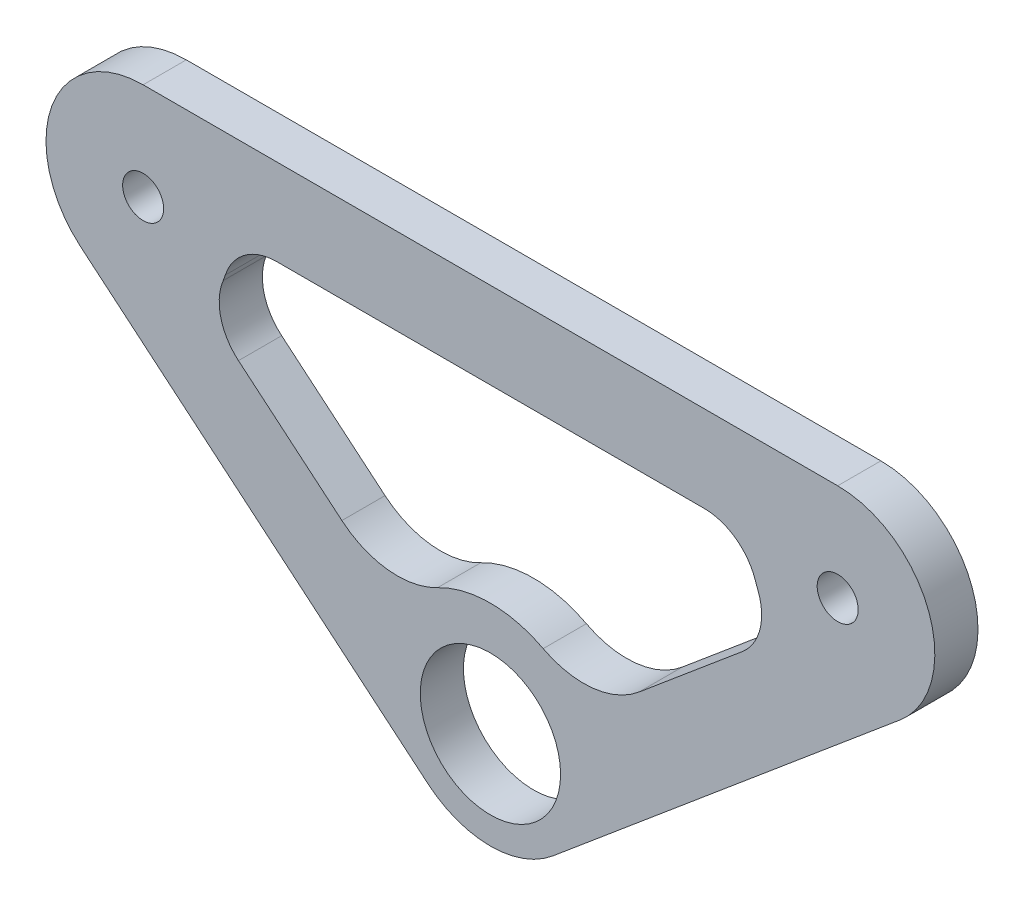
ISO-10303-21;
HEADER;
FILE_DESCRIPTION(('STEP AP214'),'2;1');
FILE_NAME('part.step','',(''),(''),'','','');
FILE_SCHEMA(('AUTOMOTIVE_DESIGN { 1 0 10303 214 1 1 1 1 }'));
ENDSEC;
DATA;
#1=APPLICATION_CONTEXT('core data for automotive mechanical design processes');
#2=APPLICATION_PROTOCOL_DEFINITION('international standard','automotive_design',2000,#1);
#3=PRODUCT_CONTEXT('',#1,'mechanical');
#4=PRODUCT('Part','Part','',(#3));
#5=PRODUCT_RELATED_PRODUCT_CATEGORY('part','',(#4));
#6=PRODUCT_DEFINITION_FORMATION('','',#4);
#7=PRODUCT_DEFINITION_CONTEXT('part definition',#1,'design');
#8=PRODUCT_DEFINITION('design','',#6,#7);
#9=PRODUCT_DEFINITION_SHAPE('','',#8);
#10=(LENGTH_UNIT() NAMED_UNIT(*) SI_UNIT(.MILLI.,.METRE.));
#11=(NAMED_UNIT(*) PLANE_ANGLE_UNIT() SI_UNIT($,.RADIAN.));
#12=(NAMED_UNIT(*) SI_UNIT($,.STERADIAN.) SOLID_ANGLE_UNIT());
#13=UNCERTAINTY_MEASURE_WITH_UNIT(LENGTH_MEASURE(1.E-05),#10,'distance_accuracy_value','');
#14=(GEOMETRIC_REPRESENTATION_CONTEXT(3) GLOBAL_UNCERTAINTY_ASSIGNED_CONTEXT((#13)) GLOBAL_UNIT_ASSIGNED_CONTEXT((#10,
#11,#12)) REPRESENTATION_CONTEXT('',''));
#15=CARTESIAN_POINT('',(0.,0.,0.));
#16=DIRECTION('',(0.,0.,1.));
#17=DIRECTION('',(1.,0.,0.));
#18=AXIS2_PLACEMENT_3D('',#15,#16,#17);
#19=CARTESIAN_POINT('',(-32.1738666109965,26.9970796068333,4.));
#20=DIRECTION('',(0.,0.,1.));
#21=DIRECTION('',(1.,0.,0.));
#22=AXIS2_PLACEMENT_3D('',#19,#20,#21);
#23=PLANE('',#22);
#24=CARTESIAN_POINT('',(32.1738666109965,26.9970796068333,4.));
#25=DIRECTION('',(0.,0.,1.));
#26=DIRECTION('',(1.,0.,0.));
#27=AXIS2_PLACEMENT_3D('',#24,#25,#26);
#28=CIRCLE('',#27,1.90000000000001);
#29=CARTESIAN_POINT('',(34.0738666109965,26.9970796068333,4.));
#30=VERTEX_POINT('',#29);
#31=EDGE_CURVE('E408',#30,#30,#28,.T.);
#32=ORIENTED_EDGE('',*,*,#31,.F.);
#33=EDGE_LOOP('',(#32));
#34=FACE_BOUND('',#33,.T.);
#35=CARTESIAN_POINT('',(8.61864834312076,16.3697556712864,4.));
#36=DIRECTION('',(0.,0.,1.));
#37=DIRECTION('',(1.,0.,0.));
#38=AXIS2_PLACEMENT_3D('',#35,#36,#37);
#39=CIRCLE('',#38,8.00000000000009);
#40=CARTESIAN_POINT('',(4.89166527582517,9.29094240802726,4.));
#41=VERTEX_POINT('',#40);
#42=CARTESIAN_POINT('',(13.7609492206135,10.2414001263348,4.));
#43=VERTEX_POINT('',#42);
#44=EDGE_CURVE('E168',#41,#43,#39,.T.);
#45=ORIENTED_EDGE('',*,*,#44,.F.);
#46=CARTESIAN_POINT('',(0.,0.,4.));
#47=DIRECTION('',(0.,0.,-1.));
#48=DIRECTION('',(1.,0.,0.));
#49=AXIS2_PLACEMENT_3D('',#46,#47,#48);
#50=CIRCLE('',#49,10.4999999999999);
#51=CARTESIAN_POINT('',(-4.89166527582612,9.29094240802688,4.));
#52=VERTEX_POINT('',#51);
#53=EDGE_CURVE('E160',#52,#41,#50,.T.);
#54=ORIENTED_EDGE('',*,*,#53,.F.);
#55=CARTESIAN_POINT('',(-8.61864834312165,16.3697556712859,4.));
#56=DIRECTION('',(0.,0.,1.));
#57=DIRECTION('',(1.,0.,0.));
#58=AXIS2_PLACEMENT_3D('',#55,#56,#57);
#59=CIRCLE('',#58,7.99999999999992);
#60=CARTESIAN_POINT('',(-13.7609492206136,10.2414001263338,4.));
#61=VERTEX_POINT('',#60);
#62=EDGE_CURVE('E203',#61,#52,#59,.T.);
#63=ORIENTED_EDGE('',*,*,#62,.F.);
#64=DIRECTION('',(0.766044443118998,-0.642787609686516,0.));
#65=VECTOR('',#64,1.);
#66=CARTESIAN_POINT('',(-13.7609492206137,10.2414001263337,4.));
#67=LINE('',#66,#65);
#68=CARTESIAN_POINT('',(-23.3412077619919,18.2801915349867,4.));
#69=VERTEX_POINT('',#68);
#70=EDGE_CURVE('E201',#69,#61,#67,.T.);
#71=ORIENTED_EDGE('',*,*,#70,.F.);
#72=CARTESIAN_POINT('',(-20.1272697135595,22.1104137505819,4.));
#73=DIRECTION('',(0.,0.,1.));
#74=DIRECTION('',(1.,0.,0.));
#75=AXIS2_PLACEMENT_3D('',#72,#73,#74);
#76=CIRCLE('',#75,5.00000000000008);
#77=CARTESIAN_POINT('',(-24.7605762125742,23.9899006183702,4.));
#78=VERTEX_POINT('',#77);
#79=EDGE_CURVE('E199',#78,#69,#76,.T.);
#80=ORIENTED_EDGE('',*,*,#79,.F.);
#81=CARTESIAN_POINT('',(-32.1738666109965,26.9970796068333,4.));
#82=DIRECTION('',(0.,0.,-1.));
#83=DIRECTION('',(1.,0.,0.));
#84=AXIS2_PLACEMENT_3D('',#81,#82,#83);
#85=CIRCLE('',#84,7.99999999999967);
#86=CARTESIAN_POINT('',(-24.5619793021638,24.5355411452953,4.));
#87=VERTEX_POINT('',#86);
#88=EDGE_CURVE('E197',#87,#78,#85,.T.);
#89=ORIENTED_EDGE('',*,*,#88,.F.);
#90=CARTESIAN_POINT('',(-19.8045497341433,22.9970796068335,4.));
#91=DIRECTION('',(0.,0.,1.));
#92=DIRECTION('',(1.,0.,0.));
#93=AXIS2_PLACEMENT_3D('',#90,#91,#92);
#94=CIRCLE('',#93,5.00000000000025);
#95=CARTESIAN_POINT('',(-19.8045497341433,27.9970796068335,4.));
#96=VERTEX_POINT('',#95);
#97=EDGE_CURVE('E195',#96,#87,#94,.T.);
#98=ORIENTED_EDGE('',*,*,#97,.F.);
#99=DIRECTION('',(-1.,0.,0.));
#100=VECTOR('',#99,1.);
#101=CARTESIAN_POINT('',(-19.8045497341433,27.9970796068335,4.));
#102=LINE('',#101,#100);
#103=CARTESIAN_POINT('',(19.8045497341433,27.9970796068335,4.));
#104=VERTEX_POINT('',#103);
#105=EDGE_CURVE('E193',#104,#96,#102,.T.);
#106=ORIENTED_EDGE('',*,*,#105,.F.);
#107=CARTESIAN_POINT('',(19.8045497341433,22.9970796068336,4.));
#108=DIRECTION('',(0.,0.,1.));
#109=DIRECTION('',(1.,0.,0.));
#110=AXIS2_PLACEMENT_3D('',#107,#108,#109);
#111=CIRCLE('',#110,4.99999999999994);
#112=CARTESIAN_POINT('',(24.5619793021642,24.5355411452938,4.));
#113=VERTEX_POINT('',#112);
#114=EDGE_CURVE('E191',#113,#104,#111,.T.);
#115=ORIENTED_EDGE('',*,*,#114,.F.);
#116=CARTESIAN_POINT('',(32.1738666109965,26.9970796068333,4.));
#117=DIRECTION('',(0.,0.,-1.));
#118=DIRECTION('',(1.,0.,0.));
#119=AXIS2_PLACEMENT_3D('',#116,#117,#118);
#120=CIRCLE('',#119,8.00000000000002);
#121=CARTESIAN_POINT('',(24.7605762125735,23.9899006183719,4.));
#122=VERTEX_POINT('',#121);
#123=EDGE_CURVE('E189',#122,#113,#120,.T.);
#124=ORIENTED_EDGE('',*,*,#123,.F.);
#125=CARTESIAN_POINT('',(20.1272697135595,22.1104137505825,4.));
#126=DIRECTION('',(0.,0.,1.));
#127=DIRECTION('',(1.,0.,0.));
#128=AXIS2_PLACEMENT_3D('',#125,#126,#127);
#129=CIRCLE('',#128,4.99999999999985);
#130=CARTESIAN_POINT('',(23.3412077619919,18.2801915349873,4.));
#131=VERTEX_POINT('',#130);
#132=EDGE_CURVE('E184',#131,#122,#129,.T.);
#133=ORIENTED_EDGE('',*,*,#132,.F.);
#134=DIRECTION('',(0.766044443119009,0.642787609686502,0.));
#135=VECTOR('',#134,1.);
#136=CARTESIAN_POINT('',(23.3412077619919,18.2801915349873,4.));
#137=LINE('',#136,#135);
#138=EDGE_CURVE('E182',#43,#131,#137,.T.);
#139=ORIENTED_EDGE('',*,*,#138,.F.);
#140=EDGE_LOOP('',(#45,#54,#63,#71,#80,#89,#98,#106,#115,#124,#133,#139));
#141=FACE_BOUND('',#140,.T.);
#142=CARTESIAN_POINT('',(-32.1738666109965,26.9970796068333,4.));
#143=DIRECTION('',(0.,0.,1.));
#144=DIRECTION('',(1.,0.,0.));
#145=AXIS2_PLACEMENT_3D('',#142,#143,#144);
#146=CIRCLE('',#145,8.99999999999999);
#147=CARTESIAN_POINT('',(-32.1738666109965,35.9970796068333,4.));
#148=VERTEX_POINT('',#147);
#149=CARTESIAN_POINT('',(-37.9589550981763,20.1026796187633,4.));
#150=VERTEX_POINT('',#149);
#151=EDGE_CURVE('E256',#148,#150,#146,.T.);
#152=ORIENTED_EDGE('',*,*,#151,.T.);
#153=DIRECTION('',(0.766044443118992,-0.642787609686523,0.));
#154=VECTOR('',#153,1.);
#155=CARTESIAN_POINT('',(-5.78508848717973,-6.89439998806977,4.));
#156=LINE('',#155,#154);
#157=CARTESIAN_POINT('',(-5.78508848717987,-6.89439998806994,4.));
#158=VERTEX_POINT('',#157);
#159=EDGE_CURVE('E259',#150,#158,#156,.T.);
#160=ORIENTED_EDGE('',*,*,#159,.T.);
#161=CARTESIAN_POINT('',(0.,0.,4.));
#162=DIRECTION('',(0.,0.,1.));
#163=DIRECTION('',(1.,0.,0.));
#164=AXIS2_PLACEMENT_3D('',#161,#162,#163);
#165=CIRCLE('',#164,8.99999999999999);
#166=CARTESIAN_POINT('',(5.78508848717529,-6.89439998807406,4.));
#167=VERTEX_POINT('',#166);
#168=EDGE_CURVE('E262',#158,#167,#165,.T.);
#169=ORIENTED_EDGE('',*,*,#168,.T.);
#170=DIRECTION('',(0.766044443118991,0.642787609686524,0.));
#171=VECTOR('',#170,1.);
#172=CARTESIAN_POINT('',(37.9589550981718,20.102679618759,4.));
#173=LINE('',#172,#171);
#174=CARTESIAN_POINT('',(37.9589550981717,20.1026796187592,4.));
#175=VERTEX_POINT('',#174);
#176=EDGE_CURVE('E264',#167,#175,#173,.T.);
#177=ORIENTED_EDGE('',*,*,#176,.T.);
#178=CARTESIAN_POINT('',(32.1738666109965,26.9970796068333,4.));
#179=DIRECTION('',(0.,0.,1.));
#180=DIRECTION('',(1.,0.,0.));
#181=AXIS2_PLACEMENT_3D('',#178,#179,#180);
#182=CIRCLE('',#181,9.00000000000016);
#183=CARTESIAN_POINT('',(32.1738666109965,35.9970796068333,4.));
#184=VERTEX_POINT('',#183);
#185=EDGE_CURVE('E266',#175,#184,#182,.T.);
#186=ORIENTED_EDGE('',*,*,#185,.T.);
#187=DIRECTION('',(-1.,0.,0.));
#188=VECTOR('',#187,1.);
#189=CARTESIAN_POINT('',(-32.1738666109965,35.9970796068333,4.));
#190=LINE('',#189,#188);
#191=EDGE_CURVE('E268',#184,#148,#190,.T.);
#192=ORIENTED_EDGE('',*,*,#191,.T.);
#193=EDGE_LOOP('',(#152,#160,#169,#177,#186,#192));
#194=FACE_BOUND('',#193,.T.);
#195=CARTESIAN_POINT('',(0.,0.,4.));
#196=DIRECTION('',(0.,0.,1.));
#197=DIRECTION('',(1.,0.,0.));
#198=AXIS2_PLACEMENT_3D('',#195,#196,#197);
#199=CIRCLE('',#198,6.49999999999995);
#200=CARTESIAN_POINT('',(6.49999999999995,0.,4.));
#201=VERTEX_POINT('',#200);
#202=EDGE_CURVE('E206',#201,#201,#199,.T.);
#203=ORIENTED_EDGE('',*,*,#202,.F.);
#204=EDGE_LOOP('',(#203));
#205=FACE_BOUND('',#204,.T.);
#206=CARTESIAN_POINT('',(-32.1738666109965,26.9970796068333,4.));
#207=DIRECTION('',(0.,0.,1.));
#208=DIRECTION('',(1.,0.,0.));
#209=AXIS2_PLACEMENT_3D('',#206,#207,#208);
#210=CIRCLE('',#209,1.90000000000001);
#211=CARTESIAN_POINT('',(-30.2738666109965,26.9970796068333,4.));
#212=VERTEX_POINT('',#211);
#213=EDGE_CURVE('E399',#212,#212,#210,.T.);
#214=ORIENTED_EDGE('',*,*,#213,.F.);
#215=EDGE_LOOP('',(#214));
#216=FACE_BOUND('',#215,.T.);
#217=ADVANCED_FACE('F35',(#34,#141,#194,#205,#216),#23,.T.);
#218=CARTESIAN_POINT('',(-32.1738666109965,26.9970796068333,0.));
#219=DIRECTION('',(0.,0.,1.));
#220=DIRECTION('',(1.,0.,0.));
#221=AXIS2_PLACEMENT_3D('',#218,#219,#220);
#222=PLANE('',#221);
#223=CARTESIAN_POINT('',(32.1738666109965,26.9970796068333,0.));
#224=DIRECTION('',(0.,0.,1.));
#225=DIRECTION('',(1.,0.,0.));
#226=AXIS2_PLACEMENT_3D('',#223,#224,#225);
#227=CIRCLE('',#226,1.90000000000001);
#228=CARTESIAN_POINT('',(34.0738666109965,26.9970796068333,0.));
#229=VERTEX_POINT('',#228);
#230=EDGE_CURVE('E405',#229,#229,#227,.T.);
#231=ORIENTED_EDGE('',*,*,#230,.T.);
#232=EDGE_LOOP('',(#231));
#233=FACE_BOUND('',#232,.T.);
#234=CARTESIAN_POINT('',(0.,0.,0.));
#235=DIRECTION('',(0.,0.,-1.));
#236=DIRECTION('',(1.,0.,0.));
#237=AXIS2_PLACEMENT_3D('',#234,#235,#236);
#238=CIRCLE('',#237,10.4999999999999);
#239=CARTESIAN_POINT('',(-4.89166527582612,9.29094240802688,0.));
#240=VERTEX_POINT('',#239);
#241=CARTESIAN_POINT('',(4.89166527582517,9.29094240802726,0.));
#242=VERTEX_POINT('',#241);
#243=EDGE_CURVE('E58',#240,#242,#238,.T.);
#244=ORIENTED_EDGE('',*,*,#243,.T.);
#245=CARTESIAN_POINT('',(8.61864834312076,16.3697556712864,0.));
#246=DIRECTION('',(0.,0.,1.));
#247=DIRECTION('',(1.,0.,0.));
#248=AXIS2_PLACEMENT_3D('',#245,#246,#247);
#249=CIRCLE('',#248,8.00000000000009);
#250=CARTESIAN_POINT('',(13.7609492206135,10.2414001263348,0.));
#251=VERTEX_POINT('',#250);
#252=EDGE_CURVE('E175',#242,#251,#249,.T.);
#253=ORIENTED_EDGE('',*,*,#252,.T.);
#254=DIRECTION('',(0.766044443119009,0.642787609686502,0.));
#255=VECTOR('',#254,1.);
#256=CARTESIAN_POINT('',(23.3412077619919,18.2801915349873,0.));
#257=LINE('',#256,#255);
#258=CARTESIAN_POINT('',(23.3412077619919,18.2801915349873,0.));
#259=VERTEX_POINT('',#258);
#260=EDGE_CURVE('E208',#251,#259,#257,.T.);
#261=ORIENTED_EDGE('',*,*,#260,.T.);
#262=CARTESIAN_POINT('',(20.1272697135595,22.1104137505825,0.));
#263=DIRECTION('',(0.,0.,1.));
#264=DIRECTION('',(1.,0.,0.));
#265=AXIS2_PLACEMENT_3D('',#262,#263,#264);
#266=CIRCLE('',#265,4.99999999999985);
#267=CARTESIAN_POINT('',(24.7605762125735,23.9899006183719,0.));
#268=VERTEX_POINT('',#267);
#269=EDGE_CURVE('E211',#259,#268,#266,.T.);
#270=ORIENTED_EDGE('',*,*,#269,.T.);
#271=CARTESIAN_POINT('',(32.1738666109965,26.9970796068333,0.));
#272=DIRECTION('',(0.,0.,-1.));
#273=DIRECTION('',(1.,0.,0.));
#274=AXIS2_PLACEMENT_3D('',#271,#272,#273);
#275=CIRCLE('',#274,8.00000000000002);
#276=CARTESIAN_POINT('',(24.5619793021642,24.5355411452938,0.));
#277=VERTEX_POINT('',#276);
#278=EDGE_CURVE('E214',#268,#277,#275,.T.);
#279=ORIENTED_EDGE('',*,*,#278,.T.);
#280=CARTESIAN_POINT('',(19.8045497341433,22.9970796068336,0.));
#281=DIRECTION('',(0.,0.,1.));
#282=DIRECTION('',(1.,0.,0.));
#283=AXIS2_PLACEMENT_3D('',#280,#281,#282);
#284=CIRCLE('',#283,4.99999999999994);
#285=CARTESIAN_POINT('',(19.8045497341433,27.9970796068335,0.));
#286=VERTEX_POINT('',#285);
#287=EDGE_CURVE('E217',#277,#286,#284,.T.);
#288=ORIENTED_EDGE('',*,*,#287,.T.);
#289=DIRECTION('',(-1.,0.,0.));
#290=VECTOR('',#289,1.);
#291=CARTESIAN_POINT('',(-19.8045497341433,27.9970796068335,0.));
#292=LINE('',#291,#290);
#293=CARTESIAN_POINT('',(-19.8045497341433,27.9970796068335,0.));
#294=VERTEX_POINT('',#293);
#295=EDGE_CURVE('E220',#286,#294,#292,.T.);
#296=ORIENTED_EDGE('',*,*,#295,.T.);
#297=CARTESIAN_POINT('',(-19.8045497341433,22.9970796068335,0.));
#298=DIRECTION('',(0.,0.,1.));
#299=DIRECTION('',(1.,0.,0.));
#300=AXIS2_PLACEMENT_3D('',#297,#298,#299);
#301=CIRCLE('',#300,5.00000000000025);
#302=CARTESIAN_POINT('',(-24.5619793021638,24.5355411452953,0.));
#303=VERTEX_POINT('',#302);
#304=EDGE_CURVE('E223',#294,#303,#301,.T.);
#305=ORIENTED_EDGE('',*,*,#304,.T.);
#306=CARTESIAN_POINT('',(-32.1738666109965,26.9970796068333,0.));
#307=DIRECTION('',(0.,0.,-1.));
#308=DIRECTION('',(1.,0.,0.));
#309=AXIS2_PLACEMENT_3D('',#306,#307,#308);
#310=CIRCLE('',#309,7.99999999999967);
#311=CARTESIAN_POINT('',(-24.7605762125742,23.9899006183702,0.));
#312=VERTEX_POINT('',#311);
#313=EDGE_CURVE('E226',#303,#312,#310,.T.);
#314=ORIENTED_EDGE('',*,*,#313,.T.);
#315=CARTESIAN_POINT('',(-20.1272697135595,22.1104137505819,0.));
#316=DIRECTION('',(0.,0.,1.));
#317=DIRECTION('',(1.,0.,0.));
#318=AXIS2_PLACEMENT_3D('',#315,#316,#317);
#319=CIRCLE('',#318,5.00000000000008);
#320=CARTESIAN_POINT('',(-23.3412077619919,18.2801915349867,0.));
#321=VERTEX_POINT('',#320);
#322=EDGE_CURVE('E229',#312,#321,#319,.T.);
#323=ORIENTED_EDGE('',*,*,#322,.T.);
#324=DIRECTION('',(0.766044443118998,-0.642787609686516,0.));
#325=VECTOR('',#324,1.);
#326=CARTESIAN_POINT('',(-13.7609492206137,10.2414001263337,0.));
#327=LINE('',#326,#325);
#328=CARTESIAN_POINT('',(-13.7609492206137,10.2414001263337,0.));
#329=VERTEX_POINT('',#328);
#330=EDGE_CURVE('E232',#321,#329,#327,.T.);
#331=ORIENTED_EDGE('',*,*,#330,.T.);
#332=CARTESIAN_POINT('',(-8.61864834312165,16.3697556712859,0.));
#333=DIRECTION('',(0.,0.,1.));
#334=DIRECTION('',(1.,0.,0.));
#335=AXIS2_PLACEMENT_3D('',#332,#333,#334);
#336=CIRCLE('',#335,7.99999999999992);
#337=EDGE_CURVE('E169',#329,#240,#336,.T.);
#338=ORIENTED_EDGE('',*,*,#337,.T.);
#339=EDGE_LOOP('',(#244,#253,#261,#270,#279,#288,#296,#305,#314,#323,#331,#338));
#340=FACE_BOUND('',#339,.T.);
#341=CARTESIAN_POINT('',(-32.1738666109965,26.9970796068333,0.));
#342=DIRECTION('',(0.,0.,1.));
#343=DIRECTION('',(1.,0.,0.));
#344=AXIS2_PLACEMENT_3D('',#341,#342,#343);
#345=CIRCLE('',#344,8.99999999999999);
#346=CARTESIAN_POINT('',(-32.1738666109965,35.9970796068333,0.));
#347=VERTEX_POINT('',#346);
#348=CARTESIAN_POINT('',(-37.9589550981763,20.1026796187633,0.));
#349=VERTEX_POINT('',#348);
#350=EDGE_CURVE('E176',#347,#349,#345,.T.);
#351=ORIENTED_EDGE('',*,*,#350,.F.);
#352=DIRECTION('',(-1.,0.,0.));
#353=VECTOR('',#352,1.);
#354=CARTESIAN_POINT('',(-32.1738666109965,35.9970796068333,0.));
#355=LINE('',#354,#353);
#356=CARTESIAN_POINT('',(32.1738666109965,35.9970796068333,0.));
#357=VERTEX_POINT('',#356);
#358=EDGE_CURVE('E260',#357,#347,#355,.T.);
#359=ORIENTED_EDGE('',*,*,#358,.F.);
#360=CARTESIAN_POINT('',(32.1738666109965,26.9970796068333,0.));
#361=DIRECTION('',(0.,0.,1.));
#362=DIRECTION('',(1.,0.,0.));
#363=AXIS2_PLACEMENT_3D('',#360,#361,#362);
#364=CIRCLE('',#363,9.00000000000016);
#365=CARTESIAN_POINT('',(37.9589550981717,20.1026796187592,0.));
#366=VERTEX_POINT('',#365);
#367=EDGE_CURVE('E279',#366,#357,#364,.T.);
#368=ORIENTED_EDGE('',*,*,#367,.F.);
#369=DIRECTION('',(0.766044443118991,0.642787609686524,0.));
#370=VECTOR('',#369,1.);
#371=CARTESIAN_POINT('',(37.9589550981718,20.102679618759,0.));
#372=LINE('',#371,#370);
#373=CARTESIAN_POINT('',(5.78508848717529,-6.89439998807406,0.));
#374=VERTEX_POINT('',#373);
#375=EDGE_CURVE('E277',#374,#366,#372,.T.);
#376=ORIENTED_EDGE('',*,*,#375,.F.);
#377=CARTESIAN_POINT('',(0.,0.,0.));
#378=DIRECTION('',(0.,0.,1.));
#379=DIRECTION('',(1.,0.,0.));
#380=AXIS2_PLACEMENT_3D('',#377,#378,#379);
#381=CIRCLE('',#380,8.99999999999999);
#382=CARTESIAN_POINT('',(-5.78508848717987,-6.89439998806994,0.));
#383=VERTEX_POINT('',#382);
#384=EDGE_CURVE('E275',#383,#374,#381,.T.);
#385=ORIENTED_EDGE('',*,*,#384,.F.);
#386=DIRECTION('',(0.766044443118992,-0.642787609686523,0.));
#387=VECTOR('',#386,1.);
#388=CARTESIAN_POINT('',(-5.78508848717973,-6.89439998806977,0.));
#389=LINE('',#388,#387);
#390=EDGE_CURVE('E273',#349,#383,#389,.T.);
#391=ORIENTED_EDGE('',*,*,#390,.F.);
#392=EDGE_LOOP('',(#351,#359,#368,#376,#385,#391));
#393=FACE_BOUND('',#392,.T.);
#394=CARTESIAN_POINT('',(0.,0.,0.));
#395=DIRECTION('',(0.,0.,1.));
#396=DIRECTION('',(1.,0.,0.));
#397=AXIS2_PLACEMENT_3D('',#394,#395,#396);
#398=CIRCLE('',#397,6.49999999999995);
#399=CARTESIAN_POINT('',(6.49999999999995,0.,0.));
#400=VERTEX_POINT('',#399);
#401=EDGE_CURVE('E411',#400,#400,#398,.T.);
#402=ORIENTED_EDGE('',*,*,#401,.T.);
#403=EDGE_LOOP('',(#402));
#404=FACE_BOUND('',#403,.T.);
#405=CARTESIAN_POINT('',(-32.1738666109965,26.9970796068333,0.));
#406=DIRECTION('',(0.,0.,1.));
#407=DIRECTION('',(1.,0.,0.));
#408=AXIS2_PLACEMENT_3D('',#405,#406,#407);
#409=CIRCLE('',#408,1.90000000000001);
#410=CARTESIAN_POINT('',(-30.2738666109965,26.9970796068333,0.));
#411=VERTEX_POINT('',#410);
#412=EDGE_CURVE('E402',#411,#411,#409,.T.);
#413=ORIENTED_EDGE('',*,*,#412,.T.);
#414=EDGE_LOOP('',(#413));
#415=FACE_BOUND('',#414,.T.);
#416=ADVANCED_FACE('F303',(#233,#340,#393,#404,#415),#222,.F.);
#417=CARTESIAN_POINT('',(-32.1738666109965,26.9970796068333,4.));
#418=DIRECTION('',(0.,0.,-1.));
#419=DIRECTION('',(-1.,0.,0.));
#420=AXIS2_PLACEMENT_3D('',#417,#418,#419);
#421=CYLINDRICAL_SURFACE('',#420,8.99999999999999);
#422=ORIENTED_EDGE('',*,*,#350,.T.);
#423=DIRECTION('',(0.,0.,-1.));
#424=VECTOR('',#423,1.);
#425=CARTESIAN_POINT('',(-37.9589550981763,20.1026796187633,4.));
#426=LINE('',#425,#424);
#427=EDGE_CURVE('E11',#150,#349,#426,.T.);
#428=ORIENTED_EDGE('',*,*,#427,.F.);
#429=ORIENTED_EDGE('',*,*,#151,.F.);
#430=DIRECTION('',(0.,0.,-1.));
#431=VECTOR('',#430,1.);
#432=CARTESIAN_POINT('',(-32.1738666109965,35.9970796068333,4.));
#433=LINE('',#432,#431);
#434=EDGE_CURVE('E270',#148,#347,#433,.T.);
#435=ORIENTED_EDGE('',*,*,#434,.T.);
#436=EDGE_LOOP('',(#422,#428,#429,#435));
#437=FACE_BOUND('',#436,.T.);
#438=ADVANCED_FACE('F37',(#437),#421,.T.);
#439=CARTESIAN_POINT('',(-5.78508848717973,-6.89439998806977,4.));
#440=DIRECTION('',(0.642787609686523,0.766044443118992,0.));
#441=DIRECTION('',(-0.766044443118992,0.642787609686523,0.));
#442=AXIS2_PLACEMENT_3D('',#439,#440,#441);
#443=PLANE('',#442);
#444=ORIENTED_EDGE('',*,*,#390,.T.);
#445=DIRECTION('',(0.,0.,-1.));
#446=VECTOR('',#445,1.);
#447=CARTESIAN_POINT('',(-5.78508848717987,-6.89439998806994,4.));
#448=LINE('',#447,#446);
#449=EDGE_CURVE('E43',#158,#383,#448,.T.);
#450=ORIENTED_EDGE('',*,*,#449,.F.);
#451=ORIENTED_EDGE('',*,*,#159,.F.);
#452=ORIENTED_EDGE('',*,*,#427,.T.);
#453=EDGE_LOOP('',(#444,#450,#451,#452));
#454=FACE_BOUND('',#453,.T.);
#455=ADVANCED_FACE('F320',(#454),#443,.F.);
#456=CARTESIAN_POINT('',(0.,0.,4.));
#457=DIRECTION('',(0.,0.,-1.));
#458=DIRECTION('',(-1.,0.,0.));
#459=AXIS2_PLACEMENT_3D('',#456,#457,#458);
#460=CYLINDRICAL_SURFACE('',#459,8.99999999999999);
#461=ORIENTED_EDGE('',*,*,#384,.T.);
#462=DIRECTION('',(0.,0.,-1.));
#463=VECTOR('',#462,1.);
#464=CARTESIAN_POINT('',(5.78508848717529,-6.89439998807406,4.));
#465=LINE('',#464,#463);
#466=EDGE_CURVE('E290',#167,#374,#465,.T.);
#467=ORIENTED_EDGE('',*,*,#466,.F.);
#468=ORIENTED_EDGE('',*,*,#168,.F.);
#469=ORIENTED_EDGE('',*,*,#449,.T.);
#470=EDGE_LOOP('',(#461,#467,#468,#469));
#471=FACE_BOUND('',#470,.T.);
#472=ADVANCED_FACE('F297',(#471),#460,.T.);
#473=CARTESIAN_POINT('',(37.9589550981718,20.102679618759,4.));
#474=DIRECTION('',(-0.642787609686524,0.766044443118991,0.));
#475=DIRECTION('',(-0.766044443118991,-0.642787609686524,0.));
#476=AXIS2_PLACEMENT_3D('',#473,#474,#475);
#477=PLANE('',#476);
#478=ORIENTED_EDGE('',*,*,#375,.T.);
#479=DIRECTION('',(0.,0.,-1.));
#480=VECTOR('',#479,1.);
#481=CARTESIAN_POINT('',(37.9589550981717,20.1026796187592,4.));
#482=LINE('',#481,#480);
#483=EDGE_CURVE('E287',#175,#366,#482,.T.);
#484=ORIENTED_EDGE('',*,*,#483,.F.);
#485=ORIENTED_EDGE('',*,*,#176,.F.);
#486=ORIENTED_EDGE('',*,*,#466,.T.);
#487=EDGE_LOOP('',(#478,#484,#485,#486));
#488=FACE_BOUND('',#487,.T.);
#489=ADVANCED_FACE('F309',(#488),#477,.F.);
#490=CARTESIAN_POINT('',(32.1738666109965,26.9970796068333,4.));
#491=DIRECTION('',(0.,0.,-1.));
#492=DIRECTION('',(-1.,0.,0.));
#493=AXIS2_PLACEMENT_3D('',#490,#491,#492);
#494=CYLINDRICAL_SURFACE('',#493,9.00000000000016);
#495=ORIENTED_EDGE('',*,*,#367,.T.);
#496=DIRECTION('',(0.,0.,-1.));
#497=VECTOR('',#496,1.);
#498=CARTESIAN_POINT('',(32.1738666109965,35.9970796068333,4.));
#499=LINE('',#498,#497);
#500=EDGE_CURVE('E284',#184,#357,#499,.T.);
#501=ORIENTED_EDGE('',*,*,#500,.F.);
#502=ORIENTED_EDGE('',*,*,#185,.F.);
#503=ORIENTED_EDGE('',*,*,#483,.T.);
#504=EDGE_LOOP('',(#495,#501,#502,#503));
#505=FACE_BOUND('',#504,.T.);
#506=ADVANCED_FACE('F313',(#505),#494,.T.);
#507=CARTESIAN_POINT('',(-32.1738666109965,35.9970796068333,4.));
#508=DIRECTION('',(0.,-1.,0.));
#509=DIRECTION('',(1.,0.,0.));
#510=AXIS2_PLACEMENT_3D('',#507,#508,#509);
#511=PLANE('',#510);
#512=ORIENTED_EDGE('',*,*,#358,.T.);
#513=ORIENTED_EDGE('',*,*,#434,.F.);
#514=ORIENTED_EDGE('',*,*,#191,.F.);
#515=ORIENTED_EDGE('',*,*,#500,.T.);
#516=EDGE_LOOP('',(#512,#513,#514,#515));
#517=FACE_BOUND('',#516,.T.);
#518=ADVANCED_FACE('F323',(#517),#511,.F.);
#519=CARTESIAN_POINT('',(0.,0.,4.));
#520=DIRECTION('',(0.,0.,-1.));
#521=DIRECTION('',(-1.,0.,0.));
#522=AXIS2_PLACEMENT_3D('',#519,#520,#521);
#523=CYLINDRICAL_SURFACE('',#522,10.4999999999999);
#524=ORIENTED_EDGE('',*,*,#243,.F.);
#525=DIRECTION('',(0.,0.,-1.));
#526=VECTOR('',#525,1.);
#527=CARTESIAN_POINT('',(-4.89166527582612,9.29094240802688,4.));
#528=LINE('',#527,#526);
#529=EDGE_CURVE('E164',#52,#240,#528,.T.);
#530=ORIENTED_EDGE('',*,*,#529,.F.);
#531=ORIENTED_EDGE('',*,*,#53,.T.);
#532=DIRECTION('',(0.,0.,-1.));
#533=VECTOR('',#532,1.);
#534=CARTESIAN_POINT('',(4.89166527582517,9.29094240802726,4.));
#535=LINE('',#534,#533);
#536=EDGE_CURVE('E163',#41,#242,#535,.T.);
#537=ORIENTED_EDGE('',*,*,#536,.T.);
#538=EDGE_LOOP('',(#524,#530,#531,#537));
#539=FACE_BOUND('',#538,.T.);
#540=ADVANCED_FACE('F162',(#539),#523,.T.);
#541=CARTESIAN_POINT('',(8.61864834312076,16.3697556712864,4.));
#542=DIRECTION('',(0.,0.,-1.));
#543=DIRECTION('',(-1.,0.,0.));
#544=AXIS2_PLACEMENT_3D('',#541,#542,#543);
#545=CYLINDRICAL_SURFACE('',#544,8.00000000000009);
#546=ORIENTED_EDGE('',*,*,#252,.F.);
#547=ORIENTED_EDGE('',*,*,#536,.F.);
#548=ORIENTED_EDGE('',*,*,#44,.T.);
#549=DIRECTION('',(0.,0.,-1.));
#550=VECTOR('',#549,1.);
#551=CARTESIAN_POINT('',(13.7609492206135,10.2414001263348,4.));
#552=LINE('',#551,#550);
#553=EDGE_CURVE('E177',#43,#251,#552,.T.);
#554=ORIENTED_EDGE('',*,*,#553,.T.);
#555=EDGE_LOOP('',(#546,#547,#548,#554));
#556=FACE_BOUND('',#555,.T.);
#557=ADVANCED_FACE('F172',(#556),#545,.F.);
#558=CARTESIAN_POINT('',(23.3412077619919,18.2801915349873,4.));
#559=DIRECTION('',(-0.642787609686502,0.766044443119009,0.));
#560=DIRECTION('',(-0.766044443119009,-0.642787609686502,0.));
#561=AXIS2_PLACEMENT_3D('',#558,#559,#560);
#562=PLANE('',#561);
#563=ORIENTED_EDGE('',*,*,#260,.F.);
#564=ORIENTED_EDGE('',*,*,#553,.F.);
#565=ORIENTED_EDGE('',*,*,#138,.T.);
#566=DIRECTION('',(0.,0.,-1.));
#567=VECTOR('',#566,1.);
#568=CARTESIAN_POINT('',(23.3412077619919,18.2801915349873,4.));
#569=LINE('',#568,#567);
#570=EDGE_CURVE('E253',#131,#259,#569,.T.);
#571=ORIENTED_EDGE('',*,*,#570,.T.);
#572=EDGE_LOOP('',(#563,#564,#565,#571));
#573=FACE_BOUND('',#572,.T.);
#574=ADVANCED_FACE('F344',(#573),#562,.T.);
#575=CARTESIAN_POINT('',(20.1272697135595,22.1104137505825,4.));
#576=DIRECTION('',(0.,0.,-1.));
#577=DIRECTION('',(-1.,0.,0.));
#578=AXIS2_PLACEMENT_3D('',#575,#576,#577);
#579=CYLINDRICAL_SURFACE('',#578,4.99999999999985);
#580=ORIENTED_EDGE('',*,*,#269,.F.);
#581=ORIENTED_EDGE('',*,*,#570,.F.);
#582=ORIENTED_EDGE('',*,*,#132,.T.);
#583=DIRECTION('',(0.,0.,-1.));
#584=VECTOR('',#583,1.);
#585=CARTESIAN_POINT('',(24.7605762125735,23.9899006183719,4.));
#586=LINE('',#585,#584);
#587=EDGE_CURVE('E251',#122,#268,#586,.T.);
#588=ORIENTED_EDGE('',*,*,#587,.T.);
#589=EDGE_LOOP('',(#580,#581,#582,#588));
#590=FACE_BOUND('',#589,.T.);
#591=ADVANCED_FACE('F347',(#590),#579,.F.);
#592=CARTESIAN_POINT('',(32.1738666109965,26.9970796068333,4.));
#593=DIRECTION('',(0.,0.,-1.));
#594=DIRECTION('',(-1.,0.,0.));
#595=AXIS2_PLACEMENT_3D('',#592,#593,#594);
#596=CYLINDRICAL_SURFACE('',#595,8.00000000000002);
#597=ORIENTED_EDGE('',*,*,#278,.F.);
#598=ORIENTED_EDGE('',*,*,#587,.F.);
#599=ORIENTED_EDGE('',*,*,#123,.T.);
#600=DIRECTION('',(0.,0.,-1.));
#601=VECTOR('',#600,1.);
#602=CARTESIAN_POINT('',(24.5619793021642,24.5355411452938,4.));
#603=LINE('',#602,#601);
#604=EDGE_CURVE('E249',#113,#277,#603,.T.);
#605=ORIENTED_EDGE('',*,*,#604,.T.);
#606=EDGE_LOOP('',(#597,#598,#599,#605));
#607=FACE_BOUND('',#606,.T.);
#608=ADVANCED_FACE('F351',(#607),#596,.T.);
#609=CARTESIAN_POINT('',(19.8045497341433,22.9970796068336,4.));
#610=DIRECTION('',(0.,0.,-1.));
#611=DIRECTION('',(-1.,0.,0.));
#612=AXIS2_PLACEMENT_3D('',#609,#610,#611);
#613=CYLINDRICAL_SURFACE('',#612,4.99999999999994);
#614=ORIENTED_EDGE('',*,*,#287,.F.);
#615=ORIENTED_EDGE('',*,*,#604,.F.);
#616=ORIENTED_EDGE('',*,*,#114,.T.);
#617=DIRECTION('',(0.,0.,-1.));
#618=VECTOR('',#617,1.);
#619=CARTESIAN_POINT('',(19.8045497341433,27.9970796068335,4.));
#620=LINE('',#619,#618);
#621=EDGE_CURVE('E247',#104,#286,#620,.T.);
#622=ORIENTED_EDGE('',*,*,#621,.T.);
#623=EDGE_LOOP('',(#614,#615,#616,#622));
#624=FACE_BOUND('',#623,.T.);
#625=ADVANCED_FACE('F355',(#624),#613,.F.);
#626=CARTESIAN_POINT('',(-19.8045497341433,27.9970796068335,4.));
#627=DIRECTION('',(0.,-1.,0.));
#628=DIRECTION('',(1.,0.,0.));
#629=AXIS2_PLACEMENT_3D('',#626,#627,#628);
#630=PLANE('',#629);
#631=ORIENTED_EDGE('',*,*,#295,.F.);
#632=ORIENTED_EDGE('',*,*,#621,.F.);
#633=ORIENTED_EDGE('',*,*,#105,.T.);
#634=DIRECTION('',(0.,0.,-1.));
#635=VECTOR('',#634,1.);
#636=CARTESIAN_POINT('',(-19.8045497341433,27.9970796068335,4.));
#637=LINE('',#636,#635);
#638=EDGE_CURVE('E245',#96,#294,#637,.T.);
#639=ORIENTED_EDGE('',*,*,#638,.T.);
#640=EDGE_LOOP('',(#631,#632,#633,#639));
#641=FACE_BOUND('',#640,.T.);
#642=ADVANCED_FACE('F359',(#641),#630,.T.);
#643=CARTESIAN_POINT('',(-19.8045497341433,22.9970796068335,4.));
#644=DIRECTION('',(0.,0.,-1.));
#645=DIRECTION('',(-1.,0.,0.));
#646=AXIS2_PLACEMENT_3D('',#643,#644,#645);
#647=CYLINDRICAL_SURFACE('',#646,5.00000000000025);
#648=ORIENTED_EDGE('',*,*,#304,.F.);
#649=ORIENTED_EDGE('',*,*,#638,.F.);
#650=ORIENTED_EDGE('',*,*,#97,.T.);
#651=DIRECTION('',(0.,0.,-1.));
#652=VECTOR('',#651,1.);
#653=CARTESIAN_POINT('',(-24.5619793021638,24.5355411452953,4.));
#654=LINE('',#653,#652);
#655=EDGE_CURVE('E243',#87,#303,#654,.T.);
#656=ORIENTED_EDGE('',*,*,#655,.T.);
#657=EDGE_LOOP('',(#648,#649,#650,#656));
#658=FACE_BOUND('',#657,.T.);
#659=ADVANCED_FACE('F363',(#658),#647,.F.);
#660=CARTESIAN_POINT('',(-32.1738666109965,26.9970796068333,4.));
#661=DIRECTION('',(0.,0.,-1.));
#662=DIRECTION('',(-1.,0.,0.));
#663=AXIS2_PLACEMENT_3D('',#660,#661,#662);
#664=CYLINDRICAL_SURFACE('',#663,7.99999999999967);
#665=ORIENTED_EDGE('',*,*,#313,.F.);
#666=ORIENTED_EDGE('',*,*,#655,.F.);
#667=ORIENTED_EDGE('',*,*,#88,.T.);
#668=DIRECTION('',(0.,0.,-1.));
#669=VECTOR('',#668,1.);
#670=CARTESIAN_POINT('',(-24.7605762125742,23.9899006183702,4.));
#671=LINE('',#670,#669);
#672=EDGE_CURVE('E241',#78,#312,#671,.T.);
#673=ORIENTED_EDGE('',*,*,#672,.T.);
#674=EDGE_LOOP('',(#665,#666,#667,#673));
#675=FACE_BOUND('',#674,.T.);
#676=ADVANCED_FACE('F367',(#675),#664,.T.);
#677=CARTESIAN_POINT('',(-20.1272697135595,22.1104137505819,4.));
#678=DIRECTION('',(0.,0.,-1.));
#679=DIRECTION('',(-1.,0.,0.));
#680=AXIS2_PLACEMENT_3D('',#677,#678,#679);
#681=CYLINDRICAL_SURFACE('',#680,5.00000000000008);
#682=ORIENTED_EDGE('',*,*,#322,.F.);
#683=ORIENTED_EDGE('',*,*,#672,.F.);
#684=ORIENTED_EDGE('',*,*,#79,.T.);
#685=DIRECTION('',(0.,0.,-1.));
#686=VECTOR('',#685,1.);
#687=CARTESIAN_POINT('',(-23.3412077619919,18.2801915349867,4.));
#688=LINE('',#687,#686);
#689=EDGE_CURVE('E239',#69,#321,#688,.T.);
#690=ORIENTED_EDGE('',*,*,#689,.T.);
#691=EDGE_LOOP('',(#682,#683,#684,#690));
#692=FACE_BOUND('',#691,.T.);
#693=ADVANCED_FACE('F371',(#692),#681,.F.);
#694=CARTESIAN_POINT('',(-13.7609492206137,10.2414001263337,4.));
#695=DIRECTION('',(0.642787609686516,0.766044443118998,0.));
#696=DIRECTION('',(-0.766044443118998,0.642787609686516,0.));
#697=AXIS2_PLACEMENT_3D('',#694,#695,#696);
#698=PLANE('',#697);
#699=ORIENTED_EDGE('',*,*,#330,.F.);
#700=ORIENTED_EDGE('',*,*,#689,.F.);
#701=ORIENTED_EDGE('',*,*,#70,.T.);
#702=DIRECTION('',(0.,0.,-1.));
#703=VECTOR('',#702,1.);
#704=CARTESIAN_POINT('',(-13.7609492206137,10.2414001263337,4.));
#705=LINE('',#704,#703);
#706=EDGE_CURVE('E50',#61,#329,#705,.T.);
#707=ORIENTED_EDGE('',*,*,#706,.T.);
#708=EDGE_LOOP('',(#699,#700,#701,#707));
#709=FACE_BOUND('',#708,.T.);
#710=ADVANCED_FACE('F375',(#709),#698,.T.);
#711=CARTESIAN_POINT('',(-8.61864834312165,16.3697556712859,4.));
#712=DIRECTION('',(0.,0.,-1.));
#713=DIRECTION('',(-1.,0.,0.));
#714=AXIS2_PLACEMENT_3D('',#711,#712,#713);
#715=CYLINDRICAL_SURFACE('',#714,7.99999999999992);
#716=ORIENTED_EDGE('',*,*,#337,.F.);
#717=ORIENTED_EDGE('',*,*,#706,.F.);
#718=ORIENTED_EDGE('',*,*,#62,.T.);
#719=ORIENTED_EDGE('',*,*,#529,.T.);
#720=EDGE_LOOP('',(#716,#717,#718,#719));
#721=FACE_BOUND('',#720,.T.);
#722=ADVANCED_FACE('F379',(#721),#715,.F.);
#723=CARTESIAN_POINT('',(0.,0.,4.));
#724=DIRECTION('',(0.,0.,-1.));
#725=DIRECTION('',(-1.,0.,0.));
#726=AXIS2_PLACEMENT_3D('',#723,#724,#725);
#727=CYLINDRICAL_SURFACE('',#726,6.49999999999995);
#728=ORIENTED_EDGE('',*,*,#202,.T.);
#729=EDGE_LOOP('',(#728));
#730=FACE_BOUND('',#729,.T.);
#731=ORIENTED_EDGE('',*,*,#401,.F.);
#732=EDGE_LOOP('',(#731));
#733=FACE_BOUND('',#732,.T.);
#734=ADVANCED_FACE('F383',(#730,#733),#727,.F.);
#735=CARTESIAN_POINT('',(32.1738666109965,26.9970796068333,4.));
#736=DIRECTION('',(0.,0.,-1.));
#737=DIRECTION('',(-1.,0.,0.));
#738=AXIS2_PLACEMENT_3D('',#735,#736,#737);
#739=CYLINDRICAL_SURFACE('',#738,1.90000000000001);
#740=ORIENTED_EDGE('',*,*,#31,.T.);
#741=EDGE_LOOP('',(#740));
#742=FACE_BOUND('',#741,.T.);
#743=ORIENTED_EDGE('',*,*,#230,.F.);
#744=EDGE_LOOP('',(#743));
#745=FACE_BOUND('',#744,.T.);
#746=ADVANCED_FACE('F386',(#742,#745),#739,.F.);
#747=CARTESIAN_POINT('',(-32.1738666109965,26.9970796068333,4.));
#748=DIRECTION('',(0.,0.,-1.));
#749=DIRECTION('',(-1.,0.,0.));
#750=AXIS2_PLACEMENT_3D('',#747,#748,#749);
#751=CYLINDRICAL_SURFACE('',#750,1.90000000000001);
#752=ORIENTED_EDGE('',*,*,#213,.T.);
#753=EDGE_LOOP('',(#752));
#754=FACE_BOUND('',#753,.T.);
#755=ORIENTED_EDGE('',*,*,#412,.F.);
#756=EDGE_LOOP('',(#755));
#757=FACE_BOUND('',#756,.T.);
#758=ADVANCED_FACE('F390',(#754,#757),#751,.F.);
#759=CLOSED_SHELL('',(#217,#416,#438,#455,#472,#489,#506,#518,#540,#557,#574,#591,#608,#625,
#642,#659,#676,#693,#710,#722,#734,#746,#758));
#760=MANIFOLD_SOLID_BREP('B2',#759);
#761=ADVANCED_BREP_SHAPE_REPRESENTATION('',(#18,#760),#14);
#762=SHAPE_DEFINITION_REPRESENTATION(#9,#761);
ENDSEC;
END-ISO-10303-21;
